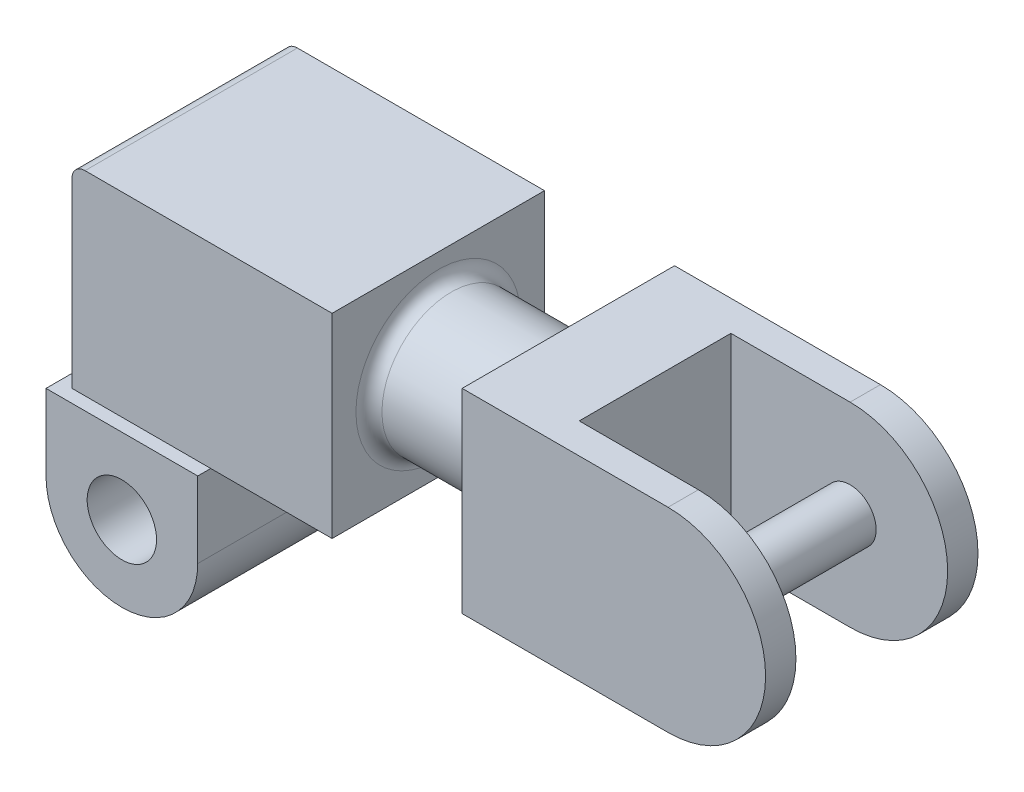
ISO-10303-21;
HEADER;
FILE_DESCRIPTION(('STEP AP214'),'2;1');
FILE_NAME('part.step','',(''),(''),'','','');
FILE_SCHEMA(('AUTOMOTIVE_DESIGN { 1 0 10303 214 1 1 1 1 }'));
ENDSEC;
DATA;
#1=APPLICATION_CONTEXT('core data for automotive mechanical design processes');
#2=APPLICATION_PROTOCOL_DEFINITION('international standard','automotive_design',2000,#1);
#3=PRODUCT_CONTEXT('',#1,'mechanical');
#4=PRODUCT('Part','Part','',(#3));
#5=PRODUCT_RELATED_PRODUCT_CATEGORY('part','',(#4));
#6=PRODUCT_DEFINITION_FORMATION('','',#4);
#7=PRODUCT_DEFINITION_CONTEXT('part definition',#1,'design');
#8=PRODUCT_DEFINITION('design','',#6,#7);
#9=PRODUCT_DEFINITION_SHAPE('','',#8);
#10=(LENGTH_UNIT() NAMED_UNIT(*) SI_UNIT(.MILLI.,.METRE.));
#11=(NAMED_UNIT(*) PLANE_ANGLE_UNIT() SI_UNIT($,.RADIAN.));
#12=(NAMED_UNIT(*) SI_UNIT($,.STERADIAN.) SOLID_ANGLE_UNIT());
#13=UNCERTAINTY_MEASURE_WITH_UNIT(LENGTH_MEASURE(1.E-05),#10,'distance_accuracy_value','');
#14=(GEOMETRIC_REPRESENTATION_CONTEXT(3) GLOBAL_UNCERTAINTY_ASSIGNED_CONTEXT((#13)) GLOBAL_UNIT_ASSIGNED_CONTEXT((#10,
#11,#12)) REPRESENTATION_CONTEXT('',''));
#15=CARTESIAN_POINT('',(0.,0.,0.));
#16=DIRECTION('',(0.,0.,1.));
#17=DIRECTION('',(1.,0.,0.));
#18=AXIS2_PLACEMENT_3D('',#15,#16,#17);
#19=CARTESIAN_POINT('',(123.,40.,-17.5));
#20=DIRECTION('',(0.,0.,-1.));
#21=DIRECTION('',(-1.,0.,0.));
#22=AXIS2_PLACEMENT_3D('',#19,#20,#21);
#23=CYLINDRICAL_SURFACE('',#22,22.5);
#24=DIRECTION('',(0.,0.,1.));
#25=VECTOR('',#24,1.);
#26=CARTESIAN_POINT('',(123.,62.5,-17.5));
#27=LINE('',#26,#25);
#28=CARTESIAN_POINT('',(123.,62.5,-17.5));
#29=VERTEX_POINT('',#28);
#30=CARTESIAN_POINT('',(123.,62.5,-24.5));
#31=VERTEX_POINT('',#30);
#32=EDGE_CURVE('E296',#29,#31,#27,.F.);
#33=ORIENTED_EDGE('',*,*,#32,.F.);
#34=CARTESIAN_POINT('',(123.,40.,-17.5));
#35=DIRECTION('',(0.,0.,1.));
#36=DIRECTION('',(1.,0.,0.));
#37=AXIS2_PLACEMENT_3D('',#34,#35,#36);
#38=CIRCLE('',#37,22.5);
#39=CARTESIAN_POINT('',(123.,17.5,-17.5));
#40=VERTEX_POINT('',#39);
#41=EDGE_CURVE('E301',#40,#29,#38,.T.);
#42=ORIENTED_EDGE('',*,*,#41,.F.);
#43=DIRECTION('',(0.,0.,-1.));
#44=VECTOR('',#43,1.);
#45=CARTESIAN_POINT('',(123.,17.5,0.));
#46=LINE('',#45,#44);
#47=CARTESIAN_POINT('',(123.,17.5,-24.5));
#48=VERTEX_POINT('',#47);
#49=EDGE_CURVE('E299',#48,#40,#46,.F.);
#50=ORIENTED_EDGE('',*,*,#49,.F.);
#51=CARTESIAN_POINT('',(123.,40.,-24.5));
#52=DIRECTION('',(0.,0.,-1.));
#53=DIRECTION('',(-1.,0.,0.));
#54=AXIS2_PLACEMENT_3D('',#51,#52,#53);
#55=CIRCLE('',#54,22.5);
#56=EDGE_CURVE('E303',#31,#48,#55,.T.);
#57=ORIENTED_EDGE('',*,*,#56,.F.);
#58=EDGE_LOOP('',(#33,#42,#50,#57));
#59=FACE_BOUND('',#58,.T.);
#60=ADVANCED_FACE('F38',(#59),#23,.T.);
#61=CARTESIAN_POINT('',(123.,40.,24.5));
#62=DIRECTION('',(0.,0.,-1.));
#63=DIRECTION('',(-1.,0.,0.));
#64=AXIS2_PLACEMENT_3D('',#61,#62,#63);
#65=CYLINDRICAL_SURFACE('',#64,22.5);
#66=DIRECTION('',(0.,0.,1.));
#67=VECTOR('',#66,1.);
#68=CARTESIAN_POINT('',(123.,62.5,24.5));
#69=LINE('',#68,#67);
#70=CARTESIAN_POINT('',(123.,62.5,24.5));
#71=VERTEX_POINT('',#70);
#72=CARTESIAN_POINT('',(123.,62.5,17.5));
#73=VERTEX_POINT('',#72);
#74=EDGE_CURVE('E288',#71,#73,#69,.F.);
#75=ORIENTED_EDGE('',*,*,#74,.F.);
#76=CARTESIAN_POINT('',(123.,40.,24.5));
#77=DIRECTION('',(0.,0.,1.));
#78=DIRECTION('',(1.,0.,0.));
#79=AXIS2_PLACEMENT_3D('',#76,#77,#78);
#80=CIRCLE('',#79,22.5);
#81=CARTESIAN_POINT('',(123.,17.5,24.5));
#82=VERTEX_POINT('',#81);
#83=EDGE_CURVE('E293',#82,#71,#80,.T.);
#84=ORIENTED_EDGE('',*,*,#83,.F.);
#85=DIRECTION('',(0.,0.,-1.));
#86=VECTOR('',#85,1.);
#87=CARTESIAN_POINT('',(123.,17.5,0.));
#88=LINE('',#87,#86);
#89=CARTESIAN_POINT('',(123.,17.5,17.5));
#90=VERTEX_POINT('',#89);
#91=EDGE_CURVE('E291',#90,#82,#88,.F.);
#92=ORIENTED_EDGE('',*,*,#91,.F.);
#93=CARTESIAN_POINT('',(123.,40.,17.5));
#94=DIRECTION('',(0.,0.,-1.));
#95=DIRECTION('',(-1.,0.,0.));
#96=AXIS2_PLACEMENT_3D('',#93,#94,#95);
#97=CIRCLE('',#96,22.5);
#98=EDGE_CURVE('E169',#73,#90,#97,.T.);
#99=ORIENTED_EDGE('',*,*,#98,.F.);
#100=EDGE_LOOP('',(#75,#84,#92,#99));
#101=FACE_BOUND('',#100,.T.);
#102=ADVANCED_FACE('F369',(#101),#65,.T.);
#103=CARTESIAN_POINT('',(-17.5,17.5,27.5));
#104=DIRECTION('',(0.,-1.,0.));
#105=DIRECTION('',(0.,0.,-1.));
#106=AXIS2_PLACEMENT_3D('',#103,#104,#105);
#107=PLANE('',#106);
#108=DIRECTION('',(-1.,0.,0.));
#109=VECTOR('',#108,1.);
#110=CARTESIAN_POINT('',(45.5,17.5,-24.5));
#111=LINE('',#110,#109);
#112=CARTESIAN_POINT('',(17.5,17.5,-24.5));
#113=VERTEX_POINT('',#112);
#114=CARTESIAN_POINT('',(-14.5,17.5,-24.5));
#115=VERTEX_POINT('',#114);
#116=EDGE_CURVE('E240',#113,#115,#111,.T.);
#117=ORIENTED_EDGE('',*,*,#116,.F.);
#118=DIRECTION('',(0.,0.,-1.));
#119=VECTOR('',#118,1.);
#120=CARTESIAN_POINT('',(17.5,17.5,27.5));
#121=LINE('',#120,#119);
#122=CARTESIAN_POINT('',(17.5,17.5,-27.5));
#123=VERTEX_POINT('',#122);
#124=EDGE_CURVE('E281',#113,#123,#121,.T.);
#125=ORIENTED_EDGE('',*,*,#124,.T.);
#126=DIRECTION('',(-1.,0.,0.));
#127=VECTOR('',#126,1.);
#128=CARTESIAN_POINT('',(-17.5,17.5,-27.5));
#129=LINE('',#128,#127);
#130=CARTESIAN_POINT('',(-17.5,17.5,-27.5));
#131=VERTEX_POINT('',#130);
#132=EDGE_CURVE('E273',#123,#131,#129,.T.);
#133=ORIENTED_EDGE('',*,*,#132,.T.);
#134=DIRECTION('',(0.,0.,-1.));
#135=VECTOR('',#134,1.);
#136=CARTESIAN_POINT('',(-17.5,17.5,27.5));
#137=LINE('',#136,#135);
#138=CARTESIAN_POINT('',(-17.5,17.5,27.5));
#139=VERTEX_POINT('',#138);
#140=EDGE_CURVE('E278',#139,#131,#137,.T.);
#141=ORIENTED_EDGE('',*,*,#140,.F.);
#142=DIRECTION('',(-1.,0.,0.));
#143=VECTOR('',#142,1.);
#144=CARTESIAN_POINT('',(-17.5,17.5,27.5));
#145=LINE('',#144,#143);
#146=CARTESIAN_POINT('',(17.5,17.5,27.5));
#147=VERTEX_POINT('',#146);
#148=EDGE_CURVE('E263',#147,#139,#145,.T.);
#149=ORIENTED_EDGE('',*,*,#148,.F.);
#150=CARTESIAN_POINT('',(17.5,17.5,24.5));
#151=VERTEX_POINT('',#150);
#152=EDGE_CURVE('E282',#147,#151,#121,.T.);
#153=ORIENTED_EDGE('',*,*,#152,.T.);
#154=DIRECTION('',(1.,0.,0.));
#155=VECTOR('',#154,1.);
#156=CARTESIAN_POINT('',(45.5,17.5,24.5));
#157=LINE('',#156,#155);
#158=CARTESIAN_POINT('',(-14.5,17.5,24.5));
#159=VERTEX_POINT('',#158);
#160=EDGE_CURVE('E233',#159,#151,#157,.T.);
#161=ORIENTED_EDGE('',*,*,#160,.F.);
#162=DIRECTION('',(0.,0.,1.));
#163=VECTOR('',#162,1.);
#164=CARTESIAN_POINT('',(-14.5,17.5,24.5));
#165=LINE('',#164,#163);
#166=EDGE_CURVE('E216',#115,#159,#165,.T.);
#167=ORIENTED_EDGE('',*,*,#166,.F.);
#168=EDGE_LOOP('',(#117,#125,#133,#141,#149,#153,#161,#167));
#169=FACE_BOUND('',#168,.T.);
#170=ADVANCED_FACE('F384',(#169),#107,.F.);
#171=CARTESIAN_POINT('',(0.,0.,27.5));
#172=DIRECTION('',(0.,0.,1.));
#173=DIRECTION('',(1.,0.,0.));
#174=AXIS2_PLACEMENT_3D('',#171,#172,#173);
#175=PLANE('',#174);
#176=CARTESIAN_POINT('',(0.,0.,27.5));
#177=DIRECTION('',(0.,0.,1.));
#178=DIRECTION('',(1.,0.,0.));
#179=AXIS2_PLACEMENT_3D('',#176,#177,#178);
#180=CIRCLE('',#179,17.5);
#181=CARTESIAN_POINT('',(-17.5,0.,27.5));
#182=VERTEX_POINT('',#181);
#183=CARTESIAN_POINT('',(17.5,0.,27.5));
#184=VERTEX_POINT('',#183);
#185=EDGE_CURVE('E257',#182,#184,#180,.T.);
#186=ORIENTED_EDGE('',*,*,#185,.T.);
#187=DIRECTION('',(0.,1.,0.));
#188=VECTOR('',#187,1.);
#189=CARTESIAN_POINT('',(17.5,17.5,27.5));
#190=LINE('',#189,#188);
#191=EDGE_CURVE('E260',#184,#147,#190,.T.);
#192=ORIENTED_EDGE('',*,*,#191,.T.);
#193=ORIENTED_EDGE('',*,*,#148,.T.);
#194=DIRECTION('',(0.,-1.,0.));
#195=VECTOR('',#194,1.);
#196=CARTESIAN_POINT('',(-17.5,0.,27.5));
#197=LINE('',#196,#195);
#198=EDGE_CURVE('E265',#139,#182,#197,.T.);
#199=ORIENTED_EDGE('',*,*,#198,.T.);
#200=EDGE_LOOP('',(#186,#192,#193,#199));
#201=FACE_BOUND('',#200,.T.);
#202=CARTESIAN_POINT('',(0.,0.,27.5));
#203=DIRECTION('',(0.,0.,1.));
#204=DIRECTION('',(1.,0.,0.));
#205=AXIS2_PLACEMENT_3D('',#202,#203,#204);
#206=CIRCLE('',#205,8.);
#207=CARTESIAN_POINT('',(8.,0.,27.5));
#208=VERTEX_POINT('',#207);
#209=EDGE_CURVE('E251',#208,#208,#206,.T.);
#210=ORIENTED_EDGE('',*,*,#209,.F.);
#211=EDGE_LOOP('',(#210));
#212=FACE_BOUND('',#211,.T.);
#213=ADVANCED_FACE('F439',(#201,#212),#175,.T.);
#214=CARTESIAN_POINT('',(0.,0.,-27.5));
#215=DIRECTION('',(0.,0.,1.));
#216=DIRECTION('',(1.,0.,0.));
#217=AXIS2_PLACEMENT_3D('',#214,#215,#216);
#218=PLANE('',#217);
#219=CARTESIAN_POINT('',(0.,0.,-27.5));
#220=DIRECTION('',(0.,0.,1.));
#221=DIRECTION('',(1.,0.,0.));
#222=AXIS2_PLACEMENT_3D('',#219,#220,#221);
#223=CIRCLE('',#222,17.5);
#224=CARTESIAN_POINT('',(-17.5,0.,-27.5));
#225=VERTEX_POINT('',#224);
#226=CARTESIAN_POINT('',(17.5,0.,-27.5));
#227=VERTEX_POINT('',#226);
#228=EDGE_CURVE('E254',#225,#227,#223,.T.);
#229=ORIENTED_EDGE('',*,*,#228,.F.);
#230=DIRECTION('',(0.,-1.,0.));
#231=VECTOR('',#230,1.);
#232=CARTESIAN_POINT('',(-17.5,0.,-27.5));
#233=LINE('',#232,#231);
#234=EDGE_CURVE('E261',#131,#225,#233,.T.);
#235=ORIENTED_EDGE('',*,*,#234,.F.);
#236=ORIENTED_EDGE('',*,*,#132,.F.);
#237=DIRECTION('',(0.,1.,0.));
#238=VECTOR('',#237,1.);
#239=CARTESIAN_POINT('',(17.5,17.5,-27.5));
#240=LINE('',#239,#238);
#241=EDGE_CURVE('E270',#227,#123,#240,.T.);
#242=ORIENTED_EDGE('',*,*,#241,.F.);
#243=EDGE_LOOP('',(#229,#235,#236,#242));
#244=FACE_BOUND('',#243,.T.);
#245=CARTESIAN_POINT('',(0.,0.,-27.5));
#246=DIRECTION('',(0.,0.,1.));
#247=DIRECTION('',(1.,0.,0.));
#248=AXIS2_PLACEMENT_3D('',#245,#246,#247);
#249=CIRCLE('',#248,8.);
#250=CARTESIAN_POINT('',(8.,0.,-27.5));
#251=VERTEX_POINT('',#250);
#252=EDGE_CURVE('E250',#251,#251,#249,.T.);
#253=ORIENTED_EDGE('',*,*,#252,.T.);
#254=EDGE_LOOP('',(#253));
#255=FACE_BOUND('',#254,.T.);
#256=ADVANCED_FACE('F429',(#244,#255),#218,.F.);
#257=CARTESIAN_POINT('',(0.,0.,27.5));
#258=DIRECTION('',(0.,0.,-1.));
#259=DIRECTION('',(-1.,0.,0.));
#260=AXIS2_PLACEMENT_3D('',#257,#258,#259);
#261=CYLINDRICAL_SURFACE('',#260,17.5);
#262=ORIENTED_EDGE('',*,*,#228,.T.);
#263=DIRECTION('',(0.,0.,-1.));
#264=VECTOR('',#263,1.);
#265=CARTESIAN_POINT('',(17.5,0.,27.5));
#266=LINE('',#265,#264);
#267=EDGE_CURVE('E284',#184,#227,#266,.T.);
#268=ORIENTED_EDGE('',*,*,#267,.F.);
#269=ORIENTED_EDGE('',*,*,#185,.F.);
#270=DIRECTION('',(0.,0.,-1.));
#271=VECTOR('',#270,1.);
#272=CARTESIAN_POINT('',(-17.5,0.,27.5));
#273=LINE('',#272,#271);
#274=EDGE_CURVE('E267',#182,#225,#273,.T.);
#275=ORIENTED_EDGE('',*,*,#274,.T.);
#276=EDGE_LOOP('',(#262,#268,#269,#275));
#277=FACE_BOUND('',#276,.T.);
#278=ADVANCED_FACE('F437',(#277),#261,.T.);
#279=CARTESIAN_POINT('',(17.5,17.5,27.5));
#280=DIRECTION('',(-1.,0.,0.));
#281=DIRECTION('',(0.,0.,1.));
#282=AXIS2_PLACEMENT_3D('',#279,#280,#281);
#283=PLANE('',#282);
#284=ORIENTED_EDGE('',*,*,#241,.T.);
#285=ORIENTED_EDGE('',*,*,#124,.F.);
#286=EDGE_CURVE('E285',#151,#113,#121,.T.);
#287=ORIENTED_EDGE('',*,*,#286,.F.);
#288=ORIENTED_EDGE('',*,*,#152,.F.);
#289=ORIENTED_EDGE('',*,*,#191,.F.);
#290=ORIENTED_EDGE('',*,*,#267,.T.);
#291=EDGE_LOOP('',(#284,#285,#287,#288,#289,#290));
#292=FACE_BOUND('',#291,.T.);
#293=ADVANCED_FACE('F424',(#292),#283,.F.);
#294=CARTESIAN_POINT('',(-17.5,0.,27.5));
#295=DIRECTION('',(1.,0.,0.));
#296=DIRECTION('',(0.,0.,-1.));
#297=AXIS2_PLACEMENT_3D('',#294,#295,#296);
#298=PLANE('',#297);
#299=ORIENTED_EDGE('',*,*,#234,.T.);
#300=ORIENTED_EDGE('',*,*,#274,.F.);
#301=ORIENTED_EDGE('',*,*,#198,.F.);
#302=ORIENTED_EDGE('',*,*,#140,.T.);
#303=EDGE_LOOP('',(#299,#300,#301,#302));
#304=FACE_BOUND('',#303,.T.);
#305=ADVANCED_FACE('F433',(#304),#298,.F.);
#306=CARTESIAN_POINT('',(0.,0.,27.5));
#307=DIRECTION('',(0.,0.,-1.));
#308=DIRECTION('',(-1.,0.,0.));
#309=AXIS2_PLACEMENT_3D('',#306,#307,#308);
#310=CYLINDRICAL_SURFACE('',#309,8.);
#311=ORIENTED_EDGE('',*,*,#209,.T.);
#312=EDGE_LOOP('',(#311));
#313=FACE_BOUND('',#312,.T.);
#314=ORIENTED_EDGE('',*,*,#252,.F.);
#315=EDGE_LOOP('',(#314));
#316=FACE_BOUND('',#315,.T.);
#317=ADVANCED_FACE('F456',(#313,#316),#310,.F.);
#318=CARTESIAN_POINT('',(0.,17.5,0.));
#319=DIRECTION('',(0.,1.,0.));
#320=DIRECTION('',(0.,0.,1.));
#321=AXIS2_PLACEMENT_3D('',#318,#319,#320);
#322=PLANE('',#321);
#323=CARTESIAN_POINT('',(45.5,17.5,24.5));
#324=VERTEX_POINT('',#323);
#325=EDGE_CURVE('E232',#151,#324,#157,.T.);
#326=ORIENTED_EDGE('',*,*,#325,.F.);
#327=ORIENTED_EDGE('',*,*,#286,.T.);
#328=CARTESIAN_POINT('',(45.5,17.5,-24.5));
#329=VERTEX_POINT('',#328);
#330=EDGE_CURVE('E224',#329,#113,#111,.T.);
#331=ORIENTED_EDGE('',*,*,#330,.F.);
#332=DIRECTION('',(0.,0.,-1.));
#333=VECTOR('',#332,1.);
#334=CARTESIAN_POINT('',(45.5,17.5,24.5));
#335=LINE('',#334,#333);
#336=EDGE_CURVE('E236',#324,#329,#335,.T.);
#337=ORIENTED_EDGE('',*,*,#336,.F.);
#338=EDGE_LOOP('',(#326,#327,#331,#337));
#339=FACE_BOUND('',#338,.T.);
#340=ADVANCED_FACE('F415',(#339),#322,.F.);
#341=CARTESIAN_POINT('',(-14.5,62.5,24.5));
#342=DIRECTION('',(1.,0.,0.));
#343=DIRECTION('',(0.,0.,-1.));
#344=AXIS2_PLACEMENT_3D('',#341,#342,#343);
#345=PLANE('',#344);
#346=DIRECTION('',(0.,-1.,0.));
#347=VECTOR('',#346,1.);
#348=CARTESIAN_POINT('',(-14.5,62.5,24.5));
#349=LINE('',#348,#347);
#350=CARTESIAN_POINT('',(-14.5,59.5,24.5));
#351=VERTEX_POINT('',#350);
#352=EDGE_CURVE('E248',#351,#159,#349,.T.);
#353=ORIENTED_EDGE('',*,*,#352,.F.);
#354=DIRECTION('',(0.,0.,1.));
#355=VECTOR('',#354,1.);
#356=CARTESIAN_POINT('',(-14.5,59.5,-24.5));
#357=LINE('',#356,#355);
#358=CARTESIAN_POINT('',(-14.5,59.5,-24.5));
#359=VERTEX_POINT('',#358);
#360=EDGE_CURVE('E53',#351,#359,#357,.F.);
#361=ORIENTED_EDGE('',*,*,#360,.T.);
#362=DIRECTION('',(0.,-1.,0.));
#363=VECTOR('',#362,1.);
#364=CARTESIAN_POINT('',(-14.5,62.5,-24.5));
#365=LINE('',#364,#363);
#366=EDGE_CURVE('E229',#359,#115,#365,.T.);
#367=ORIENTED_EDGE('',*,*,#366,.T.);
#368=ORIENTED_EDGE('',*,*,#166,.T.);
#369=EDGE_LOOP('',(#353,#361,#367,#368));
#370=FACE_BOUND('',#369,.T.);
#371=ADVANCED_FACE('F443',(#370),#345,.F.);
#372=CARTESIAN_POINT('',(45.5,62.5,24.5));
#373=DIRECTION('',(0.,0.,-1.));
#374=DIRECTION('',(-1.,0.,0.));
#375=AXIS2_PLACEMENT_3D('',#372,#373,#374);
#376=PLANE('',#375);
#377=DIRECTION('',(1.,0.,0.));
#378=VECTOR('',#377,1.);
#379=CARTESIAN_POINT('',(45.5,62.5,24.5));
#380=LINE('',#379,#378);
#381=CARTESIAN_POINT('',(-11.5,62.5,24.5));
#382=VERTEX_POINT('',#381);
#383=CARTESIAN_POINT('',(45.5,62.5,24.5));
#384=VERTEX_POINT('',#383);
#385=EDGE_CURVE('E221',#382,#384,#380,.T.);
#386=ORIENTED_EDGE('',*,*,#385,.F.);
#387=CARTESIAN_POINT('',(-11.5,59.5,24.5));
#388=DIRECTION('',(0.,0.,-1.));
#389=DIRECTION('',(-1.,0.,0.));
#390=AXIS2_PLACEMENT_3D('',#387,#388,#389);
#391=CIRCLE('',#390,3.);
#392=EDGE_CURVE('E61',#382,#351,#391,.F.);
#393=ORIENTED_EDGE('',*,*,#392,.T.);
#394=ORIENTED_EDGE('',*,*,#352,.T.);
#395=ORIENTED_EDGE('',*,*,#160,.T.);
#396=ORIENTED_EDGE('',*,*,#325,.T.);
#397=DIRECTION('',(0.,-1.,0.));
#398=VECTOR('',#397,1.);
#399=CARTESIAN_POINT('',(45.5,62.5,24.5));
#400=LINE('',#399,#398);
#401=EDGE_CURVE('E245',#384,#324,#400,.T.);
#402=ORIENTED_EDGE('',*,*,#401,.F.);
#403=EDGE_LOOP('',(#386,#393,#394,#395,#396,#402));
#404=FACE_BOUND('',#403,.T.);
#405=ADVANCED_FACE('F444',(#404),#376,.F.);
#406=CARTESIAN_POINT('',(45.5,62.5,24.5));
#407=DIRECTION('',(-1.,0.,0.));
#408=DIRECTION('',(0.,0.,1.));
#409=AXIS2_PLACEMENT_3D('',#406,#407,#408);
#410=PLANE('',#409);
#411=CARTESIAN_POINT('',(45.5,40.,0.));
#412=DIRECTION('',(-1.,0.,0.));
#413=DIRECTION('',(0.,0.,1.));
#414=AXIS2_PLACEMENT_3D('',#411,#412,#413);
#415=CIRCLE('',#414,19.);
#416=CARTESIAN_POINT('',(45.5,40.,19.));
#417=VERTEX_POINT('',#416);
#418=EDGE_CURVE('E11',#417,#417,#415,.T.);
#419=ORIENTED_EDGE('',*,*,#418,.T.);
#420=EDGE_LOOP('',(#419));
#421=FACE_BOUND('',#420,.T.);
#422=ORIENTED_EDGE('',*,*,#336,.T.);
#423=DIRECTION('',(0.,-1.,0.));
#424=VECTOR('',#423,1.);
#425=CARTESIAN_POINT('',(45.5,62.5,-24.5));
#426=LINE('',#425,#424);
#427=CARTESIAN_POINT('',(45.5,62.5,-24.5));
#428=VERTEX_POINT('',#427);
#429=EDGE_CURVE('E242',#428,#329,#426,.T.);
#430=ORIENTED_EDGE('',*,*,#429,.F.);
#431=DIRECTION('',(0.,0.,-1.));
#432=VECTOR('',#431,1.);
#433=CARTESIAN_POINT('',(45.5,62.5,24.5));
#434=LINE('',#433,#432);
#435=EDGE_CURVE('E223',#384,#428,#434,.T.);
#436=ORIENTED_EDGE('',*,*,#435,.F.);
#437=ORIENTED_EDGE('',*,*,#401,.T.);
#438=EDGE_LOOP('',(#422,#430,#436,#437));
#439=FACE_BOUND('',#438,.T.);
#440=ADVANCED_FACE('F409',(#421,#439),#410,.F.);
#441=CARTESIAN_POINT('',(45.5,62.5,-24.5));
#442=DIRECTION('',(0.,0.,1.));
#443=DIRECTION('',(1.,0.,0.));
#444=AXIS2_PLACEMENT_3D('',#441,#442,#443);
#445=PLANE('',#444);
#446=ORIENTED_EDGE('',*,*,#366,.F.);
#447=CARTESIAN_POINT('',(-11.5,59.5,-24.5));
#448=DIRECTION('',(0.,0.,1.));
#449=DIRECTION('',(1.,0.,0.));
#450=AXIS2_PLACEMENT_3D('',#447,#448,#449);
#451=CIRCLE('',#450,3.);
#452=CARTESIAN_POINT('',(-11.5,62.5,-24.5));
#453=VERTEX_POINT('',#452);
#454=EDGE_CURVE('E310',#359,#453,#451,.F.);
#455=ORIENTED_EDGE('',*,*,#454,.T.);
#456=DIRECTION('',(-1.,0.,0.));
#457=VECTOR('',#456,1.);
#458=CARTESIAN_POINT('',(45.5,62.5,-24.5));
#459=LINE('',#458,#457);
#460=EDGE_CURVE('E226',#428,#453,#459,.T.);
#461=ORIENTED_EDGE('',*,*,#460,.F.);
#462=ORIENTED_EDGE('',*,*,#429,.T.);
#463=ORIENTED_EDGE('',*,*,#330,.T.);
#464=ORIENTED_EDGE('',*,*,#116,.T.);
#465=EDGE_LOOP('',(#446,#455,#461,#462,#463,#464));
#466=FACE_BOUND('',#465,.T.);
#467=ADVANCED_FACE('F402',(#466),#445,.F.);
#468=CARTESIAN_POINT('',(0.,62.5,0.));
#469=DIRECTION('',(0.,1.,0.));
#470=DIRECTION('',(0.,0.,1.));
#471=AXIS2_PLACEMENT_3D('',#468,#469,#470);
#472=PLANE('',#471);
#473=ORIENTED_EDGE('',*,*,#460,.T.);
#474=DIRECTION('',(0.,0.,1.));
#475=VECTOR('',#474,1.);
#476=CARTESIAN_POINT('',(-11.5,62.5,24.5));
#477=LINE('',#476,#475);
#478=EDGE_CURVE('E305',#453,#382,#477,.T.);
#479=ORIENTED_EDGE('',*,*,#478,.T.);
#480=ORIENTED_EDGE('',*,*,#385,.T.);
#481=ORIENTED_EDGE('',*,*,#435,.T.);
#482=EDGE_LOOP('',(#473,#479,#480,#481));
#483=FACE_BOUND('',#482,.T.);
#484=ADVANCED_FACE('F375',(#483),#472,.T.);
#485=CARTESIAN_POINT('',(75.5,40.,0.));
#486=DIRECTION('',(-1.,0.,0.));
#487=DIRECTION('',(0.,0.,1.));
#488=AXIS2_PLACEMENT_3D('',#485,#486,#487);
#489=CYLINDRICAL_SURFACE('',#488,16.);
#490=CARTESIAN_POINT('',(72.5,40.,0.));
#491=DIRECTION('',(-1.,0.,0.));
#492=DIRECTION('',(0.,0.,1.));
#493=AXIS2_PLACEMENT_3D('',#490,#491,#492);
#494=CIRCLE('',#493,16.);
#495=CARTESIAN_POINT('',(72.5,40.,16.));
#496=VERTEX_POINT('',#495);
#497=EDGE_CURVE('E46',#496,#496,#494,.T.);
#498=CARTESIAN_POINT('',(48.5,40.,0.));
#499=DIRECTION('',(-1.,0.,0.));
#500=DIRECTION('',(0.,0.,1.));
#501=AXIS2_PLACEMENT_3D('',#498,#499,#500);
#502=CIRCLE('',#501,16.);
#503=CARTESIAN_POINT('',(48.5,40.,16.));
#504=VERTEX_POINT('',#503);
#505=EDGE_CURVE('E315',#504,#504,#502,.F.);
#506=CARTESIAN_POINT('',(72.5,40.,16.));
#507=CARTESIAN_POINT('',(72.25,40.,16.));
#508=CARTESIAN_POINT('',(72.,40.,16.));
#509=CARTESIAN_POINT('',(71.5,40.,16.));
#510=CARTESIAN_POINT('',(71.25,40.,16.));
#511=CARTESIAN_POINT('',(70.75,40.,16.));
#512=CARTESIAN_POINT('',(70.5,40.,16.));
#513=CARTESIAN_POINT('',(70.,40.,16.));
#514=CARTESIAN_POINT('',(69.75,40.,16.));
#515=CARTESIAN_POINT('',(69.25,40.,16.));
#516=CARTESIAN_POINT('',(69.,40.,16.));
#517=CARTESIAN_POINT('',(68.5,40.,16.));
#518=CARTESIAN_POINT('',(68.25,40.,16.));
#519=CARTESIAN_POINT('',(67.75,40.,16.));
#520=CARTESIAN_POINT('',(67.5,40.,16.));
#521=CARTESIAN_POINT('',(67.,40.,16.));
#522=CARTESIAN_POINT('',(66.75,40.,16.));
#523=CARTESIAN_POINT('',(66.25,40.,16.));
#524=CARTESIAN_POINT('',(66.,40.,16.));
#525=CARTESIAN_POINT('',(65.5,40.,16.));
#526=CARTESIAN_POINT('',(65.25,40.,16.));
#527=CARTESIAN_POINT('',(64.75,40.,16.));
#528=CARTESIAN_POINT('',(64.5,40.,16.));
#529=CARTESIAN_POINT('',(64.,40.,16.));
#530=CARTESIAN_POINT('',(63.75,40.,16.));
#531=CARTESIAN_POINT('',(63.25,40.,16.));
#532=CARTESIAN_POINT('',(63.,40.,16.));
#533=CARTESIAN_POINT('',(62.5,40.,16.));
#534=CARTESIAN_POINT('',(62.25,40.,16.));
#535=CARTESIAN_POINT('',(61.75,40.,16.));
#536=CARTESIAN_POINT('',(61.5,40.,16.));
#537=CARTESIAN_POINT('',(61.,40.,16.));
#538=CARTESIAN_POINT('',(60.75,40.,16.));
#539=CARTESIAN_POINT('',(60.25,40.,16.));
#540=CARTESIAN_POINT('',(60.,40.,16.));
#541=CARTESIAN_POINT('',(59.5,40.,16.));
#542=CARTESIAN_POINT('',(59.25,40.,16.));
#543=CARTESIAN_POINT('',(58.75,40.,16.));
#544=CARTESIAN_POINT('',(58.5,40.,16.));
#545=CARTESIAN_POINT('',(58.,40.,16.));
#546=CARTESIAN_POINT('',(57.75,40.,16.));
#547=CARTESIAN_POINT('',(57.25,40.,16.));
#548=CARTESIAN_POINT('',(57.,40.,16.));
#549=CARTESIAN_POINT('',(56.5,40.,16.));
#550=CARTESIAN_POINT('',(56.25,40.,16.));
#551=CARTESIAN_POINT('',(55.75,40.,16.));
#552=CARTESIAN_POINT('',(55.5,40.,16.));
#553=CARTESIAN_POINT('',(55.,40.,16.));
#554=CARTESIAN_POINT('',(54.75,40.,16.));
#555=CARTESIAN_POINT('',(54.25,40.,16.));
#556=CARTESIAN_POINT('',(54.,40.,16.));
#557=CARTESIAN_POINT('',(53.5,40.,16.));
#558=CARTESIAN_POINT('',(53.25,40.,16.));
#559=CARTESIAN_POINT('',(52.75,40.,16.));
#560=CARTESIAN_POINT('',(52.5,40.,16.));
#561=CARTESIAN_POINT('',(52.,40.,16.));
#562=CARTESIAN_POINT('',(51.75,40.,16.));
#563=CARTESIAN_POINT('',(51.25,40.,16.));
#564=CARTESIAN_POINT('',(51.,40.,16.));
#565=CARTESIAN_POINT('',(50.5,40.,16.));
#566=CARTESIAN_POINT('',(50.25,40.,16.));
#567=CARTESIAN_POINT('',(49.75,40.,16.));
#568=CARTESIAN_POINT('',(49.5,40.,16.));
#569=CARTESIAN_POINT('',(49.,40.,16.));
#570=CARTESIAN_POINT('',(48.75,40.,16.));
#571=CARTESIAN_POINT('',(48.5,40.,16.));
#572=B_SPLINE_CURVE_WITH_KNOTS('',3,(#506,#507,#508,#509,#510,#511,#512,#513,#514,#515,#516,
#517,#518,#519,#520,#521,#522,#523,#524,#525,#526,#527,#528,#529,#530,#531,#532,#533,#534,#535,
#536,#537,#538,#539,#540,#541,#542,#543,#544,#545,#546,#547,#548,#549,#550,#551,#552,#553,#554,
#555,#556,#557,#558,#559,#560,#561,#562,#563,#564,#565,#566,#567,#568,#569,#570,#571),
.UNSPECIFIED.,.F.,.F.,(4,2,2,2,2,2,2,2,2,2,2,2,2,2,2,2,2,2,2,2,2,2,2,2,2,2,2,2,2,2,2,2,4),(0.,
0.750000000000001,1.5,2.25,3.,3.75,4.5,5.25,6.00000000000001,6.75000000000001,7.50000000000001,
8.25000000000001,9.00000000000001,9.75000000000001,10.5,11.25,12.,12.75,13.5,14.25,15.,15.75,
16.5,17.25,18.,18.75,19.5,20.25,21.,21.75,22.5,23.25,24.),.UNSPECIFIED.);
#573=EDGE_CURVE('BSEAM320',#496,#504,#572,.T.);
#574=ORIENTED_EDGE('',*,*,#497,.T.);
#575=ORIENTED_EDGE('',*,*,#505,.T.);
#576=ORIENTED_EDGE('',*,*,#573,.T.);
#577=ORIENTED_EDGE('',*,*,#573,.F.);
#578=EDGE_LOOP('',(#574,#576,#575,#577));
#579=FACE_BOUND('',#578,.T.);
#580=ADVANCED_FACE('F320',(#579),#489,.T.);
#581=CARTESIAN_POINT('',(145.5,17.5,24.5));
#582=DIRECTION('',(0.,0.,1.));
#583=DIRECTION('',(1.,0.,0.));
#584=AXIS2_PLACEMENT_3D('',#581,#582,#583);
#585=PLANE('',#584);
#586=DIRECTION('',(1.,0.,0.));
#587=VECTOR('',#586,1.);
#588=CARTESIAN_POINT('',(145.5,17.5,24.5));
#589=LINE('',#588,#587);
#590=CARTESIAN_POINT('',(75.5,17.5,24.5));
#591=VERTEX_POINT('',#590);
#592=EDGE_CURVE('E175',#591,#82,#589,.T.);
#593=ORIENTED_EDGE('',*,*,#592,.T.);
#594=ORIENTED_EDGE('',*,*,#83,.T.);
#595=DIRECTION('',(1.,0.,0.));
#596=VECTOR('',#595,1.);
#597=CARTESIAN_POINT('',(145.5,62.5,24.5));
#598=LINE('',#597,#596);
#599=CARTESIAN_POINT('',(75.5,62.5,24.5));
#600=VERTEX_POINT('',#599);
#601=EDGE_CURVE('E199',#600,#71,#598,.T.);
#602=ORIENTED_EDGE('',*,*,#601,.F.);
#603=DIRECTION('',(0.,1.,0.));
#604=VECTOR('',#603,1.);
#605=CARTESIAN_POINT('',(75.5,17.5,24.5));
#606=LINE('',#605,#604);
#607=EDGE_CURVE('E214',#591,#600,#606,.T.);
#608=ORIENTED_EDGE('',*,*,#607,.F.);
#609=EDGE_LOOP('',(#593,#594,#602,#608));
#610=FACE_BOUND('',#609,.T.);
#611=ADVANCED_FACE('F333',(#610),#585,.T.);
#612=CARTESIAN_POINT('',(75.5,17.5,24.5));
#613=DIRECTION('',(-1.,0.,0.));
#614=DIRECTION('',(0.,0.,1.));
#615=AXIS2_PLACEMENT_3D('',#612,#613,#614);
#616=PLANE('',#615);
#617=CARTESIAN_POINT('',(75.5,40.,0.));
#618=DIRECTION('',(-1.,0.,0.));
#619=DIRECTION('',(0.,0.,1.));
#620=AXIS2_PLACEMENT_3D('',#617,#618,#619);
#621=CIRCLE('',#620,19.);
#622=CARTESIAN_POINT('',(75.5,40.,19.));
#623=VERTEX_POINT('',#622);
#624=EDGE_CURVE('E312',#623,#623,#621,.F.);
#625=ORIENTED_EDGE('',*,*,#624,.T.);
#626=EDGE_LOOP('',(#625));
#627=FACE_BOUND('',#626,.T.);
#628=DIRECTION('',(0.,0.,1.));
#629=VECTOR('',#628,1.);
#630=CARTESIAN_POINT('',(75.5,62.5,24.5));
#631=LINE('',#630,#629);
#632=CARTESIAN_POINT('',(75.5,62.5,-24.5));
#633=VERTEX_POINT('',#632);
#634=EDGE_CURVE('E211',#633,#600,#631,.T.);
#635=ORIENTED_EDGE('',*,*,#634,.F.);
#636=DIRECTION('',(0.,1.,0.));
#637=VECTOR('',#636,1.);
#638=CARTESIAN_POINT('',(75.5,17.5,-24.5));
#639=LINE('',#638,#637);
#640=CARTESIAN_POINT('',(75.5,17.5,-24.5));
#641=VERTEX_POINT('',#640);
#642=EDGE_CURVE('E217',#641,#633,#639,.T.);
#643=ORIENTED_EDGE('',*,*,#642,.F.);
#644=DIRECTION('',(0.,0.,1.));
#645=VECTOR('',#644,1.);
#646=CARTESIAN_POINT('',(75.5,17.5,24.5));
#647=LINE('',#646,#645);
#648=EDGE_CURVE('E183',#641,#591,#647,.T.);
#649=ORIENTED_EDGE('',*,*,#648,.T.);
#650=ORIENTED_EDGE('',*,*,#607,.T.);
#651=EDGE_LOOP('',(#635,#643,#649,#650));
#652=FACE_BOUND('',#651,.T.);
#653=ADVANCED_FACE('F329',(#627,#652),#616,.T.);
#654=CARTESIAN_POINT('',(75.5,17.5,-24.5));
#655=DIRECTION('',(0.,0.,-1.));
#656=DIRECTION('',(-1.,0.,0.));
#657=AXIS2_PLACEMENT_3D('',#654,#655,#656);
#658=PLANE('',#657);
#659=DIRECTION('',(-1.,0.,0.));
#660=VECTOR('',#659,1.);
#661=CARTESIAN_POINT('',(75.5,62.5,-24.5));
#662=LINE('',#661,#660);
#663=EDGE_CURVE('E209',#31,#633,#662,.T.);
#664=ORIENTED_EDGE('',*,*,#663,.F.);
#665=ORIENTED_EDGE('',*,*,#56,.T.);
#666=DIRECTION('',(-1.,0.,0.));
#667=VECTOR('',#666,1.);
#668=CARTESIAN_POINT('',(75.5,17.5,-24.5));
#669=LINE('',#668,#667);
#670=EDGE_CURVE('E192',#48,#641,#669,.T.);
#671=ORIENTED_EDGE('',*,*,#670,.T.);
#672=ORIENTED_EDGE('',*,*,#642,.T.);
#673=EDGE_LOOP('',(#664,#665,#671,#672));
#674=FACE_BOUND('',#673,.T.);
#675=ADVANCED_FACE('F332',(#674),#658,.T.);
#676=CARTESIAN_POINT('',(145.5,17.5,-17.5));
#677=DIRECTION('',(0.,0.,1.));
#678=DIRECTION('',(1.,0.,0.));
#679=AXIS2_PLACEMENT_3D('',#676,#677,#678);
#680=PLANE('',#679);
#681=CARTESIAN_POINT('',(123.,40.,-17.5));
#682=DIRECTION('',(0.,0.,1.));
#683=DIRECTION('',(1.,0.,0.));
#684=AXIS2_PLACEMENT_3D('',#681,#682,#683);
#685=CIRCLE('',#684,6.00000000000002);
#686=CARTESIAN_POINT('',(129.,40.,-17.5));
#687=VERTEX_POINT('',#686);
#688=EDGE_CURVE('E349',#687,#687,#685,.T.);
#689=ORIENTED_EDGE('',*,*,#688,.F.);
#690=EDGE_LOOP('',(#689));
#691=FACE_BOUND('',#690,.T.);
#692=DIRECTION('',(1.,0.,0.));
#693=VECTOR('',#692,1.);
#694=CARTESIAN_POINT('',(145.5,17.5,-17.5));
#695=LINE('',#694,#693);
#696=CARTESIAN_POINT('',(95.5,17.5,-17.5));
#697=VERTEX_POINT('',#696);
#698=EDGE_CURVE('E190',#697,#40,#695,.T.);
#699=ORIENTED_EDGE('',*,*,#698,.T.);
#700=ORIENTED_EDGE('',*,*,#41,.T.);
#701=DIRECTION('',(1.,0.,0.));
#702=VECTOR('',#701,1.);
#703=CARTESIAN_POINT('',(145.5,62.5,-17.5));
#704=LINE('',#703,#702);
#705=CARTESIAN_POINT('',(95.5,62.5,-17.5));
#706=VERTEX_POINT('',#705);
#707=EDGE_CURVE('E206',#706,#29,#704,.T.);
#708=ORIENTED_EDGE('',*,*,#707,.F.);
#709=DIRECTION('',(0.,1.,0.));
#710=VECTOR('',#709,1.);
#711=CARTESIAN_POINT('',(95.5,17.5,-17.5));
#712=LINE('',#711,#710);
#713=EDGE_CURVE('E182',#697,#706,#712,.T.);
#714=ORIENTED_EDGE('',*,*,#713,.F.);
#715=EDGE_LOOP('',(#699,#700,#708,#714));
#716=FACE_BOUND('',#715,.T.);
#717=ADVANCED_FACE('F362',(#691,#716),#680,.T.);
#718=CARTESIAN_POINT('',(95.5,17.5,-17.5));
#719=DIRECTION('',(1.,0.,0.));
#720=DIRECTION('',(0.,0.,-1.));
#721=AXIS2_PLACEMENT_3D('',#718,#719,#720);
#722=PLANE('',#721);
#723=DIRECTION('',(0.,0.,-1.));
#724=VECTOR('',#723,1.);
#725=CARTESIAN_POINT('',(95.5,62.5,-17.5));
#726=LINE('',#725,#724);
#727=CARTESIAN_POINT('',(95.5,62.5,17.5));
#728=VERTEX_POINT('',#727);
#729=EDGE_CURVE('E181',#728,#706,#726,.T.);
#730=ORIENTED_EDGE('',*,*,#729,.F.);
#731=DIRECTION('',(0.,1.,0.));
#732=VECTOR('',#731,1.);
#733=CARTESIAN_POINT('',(95.5,17.5,17.5));
#734=LINE('',#733,#732);
#735=CARTESIAN_POINT('',(95.5,17.5,17.5));
#736=VERTEX_POINT('',#735);
#737=EDGE_CURVE('E167',#736,#728,#734,.T.);
#738=ORIENTED_EDGE('',*,*,#737,.F.);
#739=DIRECTION('',(0.,0.,-1.));
#740=VECTOR('',#739,1.);
#741=CARTESIAN_POINT('',(95.5,17.5,-17.5));
#742=LINE('',#741,#740);
#743=EDGE_CURVE('E174',#736,#697,#742,.T.);
#744=ORIENTED_EDGE('',*,*,#743,.T.);
#745=ORIENTED_EDGE('',*,*,#713,.T.);
#746=EDGE_LOOP('',(#730,#738,#744,#745));
#747=FACE_BOUND('',#746,.T.);
#748=ADVANCED_FACE('F179',(#747),#722,.T.);
#749=CARTESIAN_POINT('',(95.5,17.5,17.5));
#750=DIRECTION('',(0.,0.,-1.));
#751=DIRECTION('',(-1.,0.,0.));
#752=AXIS2_PLACEMENT_3D('',#749,#750,#751);
#753=PLANE('',#752);
#754=CARTESIAN_POINT('',(123.,40.,17.5));
#755=DIRECTION('',(0.,0.,1.));
#756=DIRECTION('',(1.,0.,0.));
#757=AXIS2_PLACEMENT_3D('',#754,#755,#756);
#758=CIRCLE('',#757,6.00000000000002);
#759=CARTESIAN_POINT('',(129.,40.,17.5));
#760=VERTEX_POINT('',#759);
#761=EDGE_CURVE('E203',#760,#760,#758,.T.);
#762=ORIENTED_EDGE('',*,*,#761,.T.);
#763=EDGE_LOOP('',(#762));
#764=FACE_BOUND('',#763,.T.);
#765=DIRECTION('',(-1.,0.,0.));
#766=VECTOR('',#765,1.);
#767=CARTESIAN_POINT('',(95.5,62.5,17.5));
#768=LINE('',#767,#766);
#769=EDGE_CURVE('E202',#73,#728,#768,.T.);
#770=ORIENTED_EDGE('',*,*,#769,.F.);
#771=ORIENTED_EDGE('',*,*,#98,.T.);
#772=DIRECTION('',(-1.,0.,0.));
#773=VECTOR('',#772,1.);
#774=CARTESIAN_POINT('',(95.5,17.5,17.5));
#775=LINE('',#774,#773);
#776=EDGE_CURVE('E163',#90,#736,#775,.T.);
#777=ORIENTED_EDGE('',*,*,#776,.T.);
#778=ORIENTED_EDGE('',*,*,#737,.T.);
#779=EDGE_LOOP('',(#770,#771,#777,#778));
#780=FACE_BOUND('',#779,.T.);
#781=ADVANCED_FACE('F166',(#764,#780),#753,.T.);
#782=CARTESIAN_POINT('',(0.,17.5,0.));
#783=DIRECTION('',(0.,-1.,0.));
#784=DIRECTION('',(0.,0.,-1.));
#785=AXIS2_PLACEMENT_3D('',#782,#783,#784);
#786=PLANE('',#785);
#787=ORIENTED_EDGE('',*,*,#670,.F.);
#788=ORIENTED_EDGE('',*,*,#49,.T.);
#789=ORIENTED_EDGE('',*,*,#698,.F.);
#790=ORIENTED_EDGE('',*,*,#743,.F.);
#791=ORIENTED_EDGE('',*,*,#776,.F.);
#792=ORIENTED_EDGE('',*,*,#91,.T.);
#793=ORIENTED_EDGE('',*,*,#592,.F.);
#794=ORIENTED_EDGE('',*,*,#648,.F.);
#795=EDGE_LOOP('',(#787,#788,#789,#790,#791,#792,#793,#794));
#796=FACE_BOUND('',#795,.T.);
#797=ADVANCED_FACE('F187',(#796),#786,.T.);
#798=CARTESIAN_POINT('',(0.,62.5,0.));
#799=DIRECTION('',(0.,-1.,0.));
#800=DIRECTION('',(0.,0.,-1.));
#801=AXIS2_PLACEMENT_3D('',#798,#799,#800);
#802=PLANE('',#801);
#803=ORIENTED_EDGE('',*,*,#707,.T.);
#804=ORIENTED_EDGE('',*,*,#32,.T.);
#805=ORIENTED_EDGE('',*,*,#663,.T.);
#806=ORIENTED_EDGE('',*,*,#634,.T.);
#807=ORIENTED_EDGE('',*,*,#601,.T.);
#808=ORIENTED_EDGE('',*,*,#74,.T.);
#809=ORIENTED_EDGE('',*,*,#769,.T.);
#810=ORIENTED_EDGE('',*,*,#729,.T.);
#811=EDGE_LOOP('',(#803,#804,#805,#806,#807,#808,#809,#810));
#812=FACE_BOUND('',#811,.T.);
#813=ADVANCED_FACE('F340',(#812),#802,.F.);
#814=CARTESIAN_POINT('',(-11.5,59.5,0.));
#815=DIRECTION('',(0.,0.,-1.));
#816=DIRECTION('',(-1.,0.,0.));
#817=AXIS2_PLACEMENT_3D('',#814,#815,#816);
#818=CYLINDRICAL_SURFACE('',#817,3.);
#819=ORIENTED_EDGE('',*,*,#454,.F.);
#820=ORIENTED_EDGE('',*,*,#360,.F.);
#821=ORIENTED_EDGE('',*,*,#392,.F.);
#822=ORIENTED_EDGE('',*,*,#478,.F.);
#823=EDGE_LOOP('',(#819,#820,#821,#822));
#824=FACE_BOUND('',#823,.T.);
#825=ADVANCED_FACE('F326',(#824),#818,.T.);
#826=CARTESIAN_POINT('',(72.5,40.,0.));
#827=DIRECTION('',(-1.,0.,0.));
#828=DIRECTION('',(0.,0.,1.));
#829=AXIS2_PLACEMENT_3D('',#826,#827,#828);
#830=TOROIDAL_SURFACE('',#829,19.,3.);
#831=ORIENTED_EDGE('',*,*,#497,.F.);
#832=EDGE_LOOP('',(#831));
#833=FACE_BOUND('',#832,.T.);
#834=ORIENTED_EDGE('',*,*,#624,.F.);
#835=EDGE_LOOP('',(#834));
#836=FACE_BOUND('',#835,.T.);
#837=ADVANCED_FACE('F323',(#833,#836),#830,.F.);
#838=CARTESIAN_POINT('',(48.5,40.,0.));
#839=DIRECTION('',(-1.,0.,0.));
#840=DIRECTION('',(0.,0.,1.));
#841=AXIS2_PLACEMENT_3D('',#838,#839,#840);
#842=TOROIDAL_SURFACE('',#841,19.,3.);
#843=ORIENTED_EDGE('',*,*,#418,.F.);
#844=EDGE_LOOP('',(#843));
#845=FACE_BOUND('',#844,.T.);
#846=ORIENTED_EDGE('',*,*,#505,.F.);
#847=EDGE_LOOP('',(#846));
#848=FACE_BOUND('',#847,.T.);
#849=ADVANCED_FACE('F40',(#845,#848),#842,.F.);
#850=CARTESIAN_POINT('',(123.,40.,17.5));
#851=DIRECTION('',(0.,0.,-1.));
#852=DIRECTION('',(-1.,0.,0.));
#853=AXIS2_PLACEMENT_3D('',#850,#851,#852);
#854=CYLINDRICAL_SURFACE('',#853,6.00000000000002);
#855=ORIENTED_EDGE('',*,*,#761,.F.);
#856=EDGE_LOOP('',(#855));
#857=FACE_BOUND('',#856,.T.);
#858=ORIENTED_EDGE('',*,*,#688,.T.);
#859=EDGE_LOOP('',(#858));
#860=FACE_BOUND('',#859,.T.);
#861=ADVANCED_FACE('F356',(#857,#860),#854,.T.);
#862=CLOSED_SHELL('',(#60,#102,#170,#213,#256,#278,#293,#305,#317,#340,#371,#405,#440,#467,#484,
#580,#611,#653,#675,#717,#748,#781,#797,#813,#825,#837,#849,#861));
#863=MANIFOLD_SOLID_BREP('B2',#862);
#864=ADVANCED_BREP_SHAPE_REPRESENTATION('',(#18,#863),#14);
#865=SHAPE_DEFINITION_REPRESENTATION(#9,#864);
ENDSEC;
END-ISO-10303-21;
